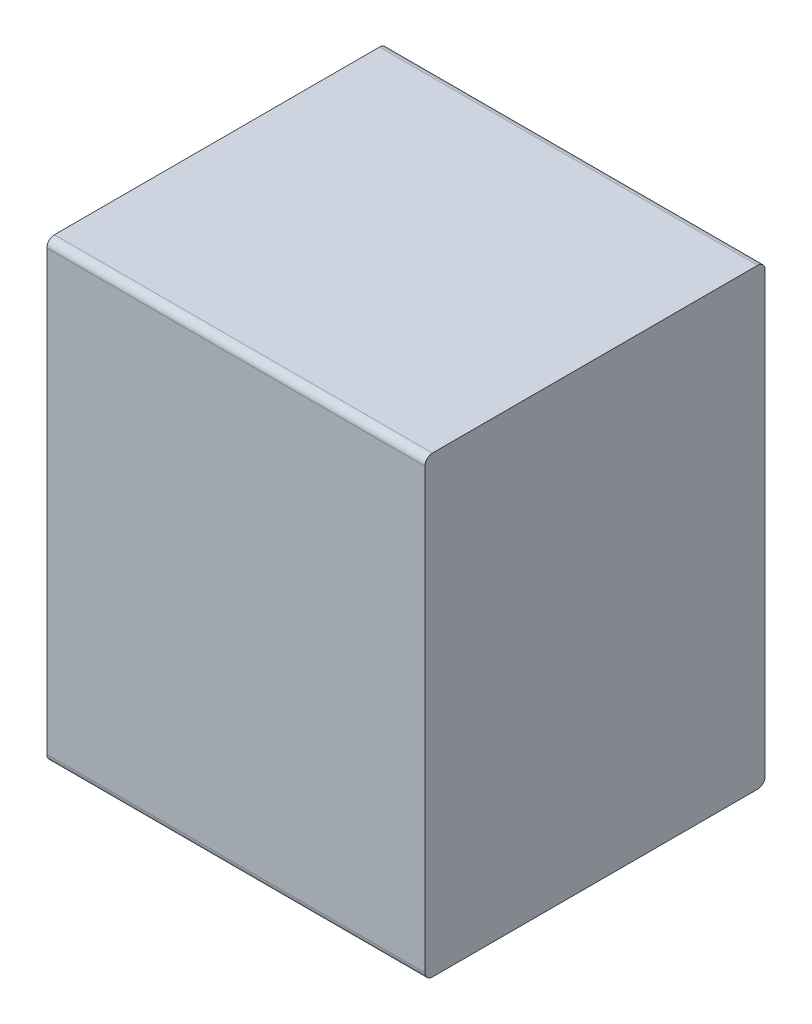
ISO-10303-21;
HEADER;
FILE_DESCRIPTION(('STEP AP214'),'2;1');
FILE_NAME('part.step','',(''),(''),'','','');
FILE_SCHEMA(('AUTOMOTIVE_DESIGN { 1 0 10303 214 1 1 1 1 }'));
ENDSEC;
DATA;
#1=APPLICATION_CONTEXT('core data for automotive mechanical design processes');
#2=APPLICATION_PROTOCOL_DEFINITION('international standard','automotive_design',2000,#1);
#3=PRODUCT_CONTEXT('',#1,'mechanical');
#4=PRODUCT('Part','Part','',(#3));
#5=PRODUCT_RELATED_PRODUCT_CATEGORY('part','',(#4));
#6=PRODUCT_DEFINITION_FORMATION('','',#4);
#7=PRODUCT_DEFINITION_CONTEXT('part definition',#1,'design');
#8=PRODUCT_DEFINITION('design','',#6,#7);
#9=PRODUCT_DEFINITION_SHAPE('','',#8);
#10=(LENGTH_UNIT() NAMED_UNIT(*) SI_UNIT(.MILLI.,.METRE.));
#11=(NAMED_UNIT(*) PLANE_ANGLE_UNIT() SI_UNIT($,.RADIAN.));
#12=(NAMED_UNIT(*) SI_UNIT($,.STERADIAN.) SOLID_ANGLE_UNIT());
#13=UNCERTAINTY_MEASURE_WITH_UNIT(LENGTH_MEASURE(1.E-05),#10,'distance_accuracy_value','');
#14=(GEOMETRIC_REPRESENTATION_CONTEXT(3) GLOBAL_UNCERTAINTY_ASSIGNED_CONTEXT((#13)) GLOBAL_UNIT_ASSIGNED_CONTEXT((#10,
#11,#12)) REPRESENTATION_CONTEXT('',''));
#15=CARTESIAN_POINT('',(0.,0.,0.));
#16=DIRECTION('',(0.,0.,1.));
#17=DIRECTION('',(1.,0.,0.));
#18=AXIS2_PLACEMENT_3D('',#15,#16,#17);
#19=CARTESIAN_POINT('',(91.686000000119,29.5359999998974,2.033253988));
#20=DIRECTION('',(-1.,2.05103428515331E-10,0.));
#21=DIRECTION('',(-2.05103428515331E-10,-1.,0.));
#22=AXIS2_PLACEMENT_3D('',#19,#20,#21);
#23=CYLINDRICAL_SURFACE('',#22,0.02);
#24=CARTESIAN_POINT('',(90.686000000119,29.5360000001025,2.033253988));
#25=DIRECTION('',(-1.,2.05103428515331E-10,0.));
#26=DIRECTION('',(-2.05103428515331E-10,-1.,0.));
#27=AXIS2_PLACEMENT_3D('',#24,#25,#26);
#28=CIRCLE('',#27,0.02);
#29=CARTESIAN_POINT('',(90.686000000119,29.536,2.013253988));
#30=VERTEX_POINT('',#29);
#31=CARTESIAN_POINT('',(90.6860000001231,29.5560000001026,2.033253988));
#32=VERTEX_POINT('',#31);
#33=EDGE_CURVE('E100',#30,#32,#28,.F.);
#34=ORIENTED_EDGE('',*,*,#33,.T.);
#35=DIRECTION('',(1.,-2.05103428515331E-10,0.));
#36=VECTOR('',#35,1.);
#37=CARTESIAN_POINT('',(91.6860000001231,29.5559999998974,2.033253988));
#38=LINE('',#37,#36);
#39=CARTESIAN_POINT('',(91.6860000001231,29.5559999998974,2.033253988));
#40=VERTEX_POINT('',#39);
#41=EDGE_CURVE('E97',#32,#40,#38,.T.);
#42=ORIENTED_EDGE('',*,*,#41,.T.);
#43=CARTESIAN_POINT('',(91.686000000119,29.5359999998974,2.033253988));
#44=DIRECTION('',(-1.,2.05103428515331E-10,0.));
#45=DIRECTION('',(-2.05103428515331E-10,-1.,0.));
#46=AXIS2_PLACEMENT_3D('',#43,#44,#45);
#47=CIRCLE('',#46,0.02);
#48=CARTESIAN_POINT('',(91.686000000119,29.5359999998974,2.013253988));
#49=VERTEX_POINT('',#48);
#50=EDGE_CURVE('E127',#40,#49,#47,.T.);
#51=ORIENTED_EDGE('',*,*,#50,.T.);
#52=DIRECTION('',(1.,0.,0.));
#53=VECTOR('',#52,1.);
#54=CARTESIAN_POINT('',(90.6860000001231,29.5359999998974,2.013253988));
#55=LINE('',#54,#53);
#56=EDGE_CURVE('E92',#49,#30,#55,.F.);
#57=ORIENTED_EDGE('',*,*,#56,.T.);
#58=EDGE_LOOP('',(#34,#42,#51,#57));
#59=FACE_BOUND('',#58,.T.);
#60=ADVANCED_FACE('F17',(#59),#23,.T.);
#61=CARTESIAN_POINT('',(90.6860000001231,29.5560000001026,2.013253988));
#62=DIRECTION('',(0.,0.,1.));
#63=DIRECTION('',(1.,0.,0.));
#64=AXIS2_PLACEMENT_3D('',#61,#62,#63);
#65=PLANE('',#64);
#66=ORIENTED_EDGE('',*,*,#56,.F.);
#67=DIRECTION('',(-2.05103428515331E-10,-1.,0.));
#68=VECTOR('',#67,1.);
#69=CARTESIAN_POINT('',(91.6859999998769,28.3559999998974,2.013253988));
#70=LINE('',#69,#68);
#71=CARTESIAN_POINT('',(91.685999999881,28.3759999998975,2.013253988));
#72=VERTEX_POINT('',#71);
#73=EDGE_CURVE('E90',#49,#72,#70,.T.);
#74=ORIENTED_EDGE('',*,*,#73,.T.);
#75=DIRECTION('',(1.,-2.05103428515331E-10,0.));
#76=VECTOR('',#75,1.);
#77=CARTESIAN_POINT('',(90.685999999881,28.3760000001026,2.013253988));
#78=LINE('',#77,#76);
#79=CARTESIAN_POINT('',(90.685999999881,28.3760000001026,2.013253988));
#80=VERTEX_POINT('',#79);
#81=EDGE_CURVE('E83',#80,#72,#78,.T.);
#82=ORIENTED_EDGE('',*,*,#81,.F.);
#83=DIRECTION('',(2.05103428515331E-10,1.,0.));
#84=VECTOR('',#83,1.);
#85=CARTESIAN_POINT('',(90.6860000001231,29.5560000001026,2.013253988));
#86=LINE('',#85,#84);
#87=EDGE_CURVE('E87',#80,#30,#86,.T.);
#88=ORIENTED_EDGE('',*,*,#87,.T.);
#89=EDGE_LOOP('',(#66,#74,#82,#88));
#90=FACE_BOUND('',#89,.T.);
#91=ADVANCED_FACE('F85',(#90),#65,.F.);
#92=CARTESIAN_POINT('',(90.685999999881,28.3760000001026,2.033253988));
#93=DIRECTION('',(1.,-2.05103428515331E-10,0.));
#94=DIRECTION('',(2.05103428515331E-10,1.,0.));
#95=AXIS2_PLACEMENT_3D('',#92,#93,#94);
#96=CYLINDRICAL_SURFACE('',#95,0.02);
#97=CARTESIAN_POINT('',(91.685999999881,28.3759999998975,2.033253988));
#98=DIRECTION('',(1.,-2.05103428515331E-10,0.));
#99=DIRECTION('',(2.05103428515331E-10,1.,0.));
#100=AXIS2_PLACEMENT_3D('',#97,#98,#99);
#101=CIRCLE('',#100,0.02);
#102=CARTESIAN_POINT('',(91.6859999998769,28.3559999998974,2.033253988));
#103=VERTEX_POINT('',#102);
#104=EDGE_CURVE('E125',#72,#103,#101,.F.);
#105=ORIENTED_EDGE('',*,*,#104,.T.);
#106=DIRECTION('',(-1.,2.05103428515331E-10,0.));
#107=VECTOR('',#106,1.);
#108=CARTESIAN_POINT('',(90.6859999998769,28.3560000001026,2.033253988));
#109=LINE('',#108,#107);
#110=CARTESIAN_POINT('',(90.685999999877,28.3560000001026,2.033253988));
#111=VERTEX_POINT('',#110);
#112=EDGE_CURVE('E77',#103,#111,#109,.T.);
#113=ORIENTED_EDGE('',*,*,#112,.T.);
#114=CARTESIAN_POINT('',(90.685999999881,28.3760000001026,2.033253988));
#115=DIRECTION('',(1.,-2.05103428515331E-10,0.));
#116=DIRECTION('',(2.05103428515331E-10,1.,0.));
#117=AXIS2_PLACEMENT_3D('',#114,#115,#116);
#118=CIRCLE('',#117,0.02);
#119=EDGE_CURVE('E20',#111,#80,#118,.T.);
#120=ORIENTED_EDGE('',*,*,#119,.T.);
#121=ORIENTED_EDGE('',*,*,#81,.T.);
#122=EDGE_LOOP('',(#105,#113,#120,#121));
#123=FACE_BOUND('',#122,.T.);
#124=ADVANCED_FACE('F95',(#123),#96,.T.);
#125=CARTESIAN_POINT('',(90.6859999998769,28.3560000001026,2.913253988));
#126=DIRECTION('',(2.05103428515331E-10,1.,0.));
#127=DIRECTION('',(-1.,2.05103428515331E-10,0.));
#128=AXIS2_PLACEMENT_3D('',#125,#126,#127);
#129=PLANE('',#128);
#130=DIRECTION('',(-1.,2.05103428515331E-10,0.));
#131=VECTOR('',#130,1.);
#132=CARTESIAN_POINT('',(90.6859999998769,28.3560000001026,2.893253988));
#133=LINE('',#132,#131);
#134=CARTESIAN_POINT('',(90.6859999998769,28.3560000001026,2.893253988));
#135=VERTEX_POINT('',#134);
#136=CARTESIAN_POINT('',(91.6859999998769,28.3559999998974,2.893253988));
#137=VERTEX_POINT('',#136);
#138=EDGE_CURVE('E110',#135,#137,#133,.F.);
#139=ORIENTED_EDGE('',*,*,#138,.F.);
#140=DIRECTION('',(0.,0.,1.));
#141=VECTOR('',#140,1.);
#142=CARTESIAN_POINT('',(90.685999999877,28.3560000001026,2.913253988));
#143=LINE('',#142,#141);
#144=EDGE_CURVE('E130',#135,#111,#143,.F.);
#145=ORIENTED_EDGE('',*,*,#144,.T.);
#146=ORIENTED_EDGE('',*,*,#112,.F.);
#147=DIRECTION('',(0.,0.,1.));
#148=VECTOR('',#147,1.);
#149=CARTESIAN_POINT('',(91.6859999998769,28.3559999998974,2.913253988));
#150=LINE('',#149,#148);
#151=EDGE_CURVE('E124',#103,#137,#150,.T.);
#152=ORIENTED_EDGE('',*,*,#151,.T.);
#153=EDGE_LOOP('',(#139,#145,#146,#152));
#154=FACE_BOUND('',#153,.T.);
#155=ADVANCED_FACE('F148',(#154),#129,.F.);
#156=CARTESIAN_POINT('',(91.6860000001231,29.5559999998974,2.913253988));
#157=DIRECTION('',(-2.05103428515331E-10,-1.,0.));
#158=DIRECTION('',(1.,-2.05103428515331E-10,0.));
#159=AXIS2_PLACEMENT_3D('',#156,#157,#158);
#160=PLANE('',#159);
#161=DIRECTION('',(1.,-2.05103428515331E-10,0.));
#162=VECTOR('',#161,1.);
#163=CARTESIAN_POINT('',(90.6860000001231,29.5560000001026,2.893253988));
#164=LINE('',#163,#162);
#165=CARTESIAN_POINT('',(91.6860000001231,29.5559999998974,2.893253988));
#166=VERTEX_POINT('',#165);
#167=CARTESIAN_POINT('',(90.6860000001231,29.5560000001026,2.893253988));
#168=VERTEX_POINT('',#167);
#169=EDGE_CURVE('E106',#166,#168,#164,.F.);
#170=ORIENTED_EDGE('',*,*,#169,.F.);
#171=DIRECTION('',(0.,0.,1.));
#172=VECTOR('',#171,1.);
#173=CARTESIAN_POINT('',(91.686000000123,29.5559999998974,2.913253988));
#174=LINE('',#173,#172);
#175=EDGE_CURVE('E113',#166,#40,#174,.F.);
#176=ORIENTED_EDGE('',*,*,#175,.T.);
#177=ORIENTED_EDGE('',*,*,#41,.F.);
#178=DIRECTION('',(0.,0.,1.));
#179=VECTOR('',#178,1.);
#180=CARTESIAN_POINT('',(90.6860000001231,29.5560000001026,2.913253988));
#181=LINE('',#180,#179);
#182=EDGE_CURVE('E102',#32,#168,#181,.T.);
#183=ORIENTED_EDGE('',*,*,#182,.T.);
#184=EDGE_LOOP('',(#170,#176,#177,#183));
#185=FACE_BOUND('',#184,.T.);
#186=ADVANCED_FACE('F160',(#185),#160,.F.);
#187=CARTESIAN_POINT('',(90.6860000001231,29.5560000001026,2.913253988));
#188=DIRECTION('',(1.,-2.05103428515331E-10,0.));
#189=DIRECTION('',(2.05103428515331E-10,1.,0.));
#190=AXIS2_PLACEMENT_3D('',#187,#188,#189);
#191=PLANE('',#190);
#192=CARTESIAN_POINT('',(90.685999999881,28.3760000001026,2.893253988));
#193=DIRECTION('',(-1.,2.05103428515331E-10,0.));
#194=DIRECTION('',(-2.05103428515331E-10,-1.,0.));
#195=AXIS2_PLACEMENT_3D('',#192,#193,#194);
#196=CIRCLE('',#195,0.02);
#197=CARTESIAN_POINT('',(90.686,28.3760000001026,2.913253988));
#198=VERTEX_POINT('',#197);
#199=EDGE_CURVE('E114',#198,#135,#196,.F.);
#200=ORIENTED_EDGE('',*,*,#199,.F.);
#201=DIRECTION('',(0.,1.,0.));
#202=VECTOR('',#201,1.);
#203=CARTESIAN_POINT('',(90.686000000119,29.5560000001026,2.913253988));
#204=LINE('',#203,#202);
#205=CARTESIAN_POINT('',(90.686000000119,29.5359999999487,2.913253988));
#206=VERTEX_POINT('',#205);
#207=EDGE_CURVE('E120',#206,#198,#204,.F.);
#208=ORIENTED_EDGE('',*,*,#207,.F.);
#209=CARTESIAN_POINT('',(90.686000000119,29.5360000001026,2.893253988));
#210=DIRECTION('',(1.,-2.05103428515331E-10,0.));
#211=DIRECTION('',(2.05103428515331E-10,1.,0.));
#212=AXIS2_PLACEMENT_3D('',#209,#210,#211);
#213=CIRCLE('',#212,0.02);
#214=EDGE_CURVE('E109',#168,#206,#213,.T.);
#215=ORIENTED_EDGE('',*,*,#214,.F.);
#216=ORIENTED_EDGE('',*,*,#182,.F.);
#217=ORIENTED_EDGE('',*,*,#33,.F.);
#218=ORIENTED_EDGE('',*,*,#87,.F.);
#219=ORIENTED_EDGE('',*,*,#119,.F.);
#220=ORIENTED_EDGE('',*,*,#144,.F.);
#221=EDGE_LOOP('',(#200,#208,#215,#216,#217,#218,#219,#220));
#222=FACE_BOUND('',#221,.T.);
#223=ADVANCED_FACE('F98',(#222),#191,.F.);
#224=CARTESIAN_POINT('',(90.685999999881,28.3760000001026,2.893253988));
#225=DIRECTION('',(-1.,2.05103428515331E-10,0.));
#226=DIRECTION('',(-2.05103428515331E-10,-1.,0.));
#227=AXIS2_PLACEMENT_3D('',#224,#225,#226);
#228=CYLINDRICAL_SURFACE('',#227,0.02);
#229=CARTESIAN_POINT('',(91.685999999881,28.3759999998975,2.893253988));
#230=DIRECTION('',(-1.,2.05103428515331E-10,0.));
#231=DIRECTION('',(-2.05103428515331E-10,-1.,0.));
#232=AXIS2_PLACEMENT_3D('',#229,#230,#231);
#233=CIRCLE('',#232,0.02);
#234=CARTESIAN_POINT('',(91.685999999881,28.376,2.913253988));
#235=VERTEX_POINT('',#234);
#236=EDGE_CURVE('E122',#137,#235,#233,.T.);
#237=ORIENTED_EDGE('',*,*,#236,.T.);
#238=DIRECTION('',(1.,0.,0.));
#239=VECTOR('',#238,1.);
#240=CARTESIAN_POINT('',(90.6860000001231,28.3760000001026,2.913253988));
#241=LINE('',#240,#239);
#242=EDGE_CURVE('E138',#198,#235,#241,.T.);
#243=ORIENTED_EDGE('',*,*,#242,.F.);
#244=ORIENTED_EDGE('',*,*,#199,.T.);
#245=ORIENTED_EDGE('',*,*,#138,.T.);
#246=EDGE_LOOP('',(#237,#243,#244,#245));
#247=FACE_BOUND('',#246,.T.);
#248=ADVANCED_FACE('F150',(#247),#228,.T.);
#249=CARTESIAN_POINT('',(91.6859999998769,28.3559999998974,2.913253988));
#250=DIRECTION('',(-1.,2.05103428515331E-10,0.));
#251=DIRECTION('',(-2.05103428515331E-10,-1.,0.));
#252=AXIS2_PLACEMENT_3D('',#249,#250,#251);
#253=PLANE('',#252);
#254=ORIENTED_EDGE('',*,*,#236,.F.);
#255=ORIENTED_EDGE('',*,*,#151,.F.);
#256=ORIENTED_EDGE('',*,*,#104,.F.);
#257=ORIENTED_EDGE('',*,*,#73,.F.);
#258=ORIENTED_EDGE('',*,*,#50,.F.);
#259=ORIENTED_EDGE('',*,*,#175,.F.);
#260=CARTESIAN_POINT('',(91.686000000119,29.5359999998975,2.893253988));
#261=DIRECTION('',(1.,-2.05103428515331E-10,0.));
#262=DIRECTION('',(2.05103428515331E-10,1.,0.));
#263=AXIS2_PLACEMENT_3D('',#260,#261,#262);
#264=CIRCLE('',#263,0.02);
#265=CARTESIAN_POINT('',(91.686,29.5359999998974,2.913253988));
#266=VERTEX_POINT('',#265);
#267=EDGE_CURVE('E35',#266,#166,#264,.F.);
#268=ORIENTED_EDGE('',*,*,#267,.F.);
#269=DIRECTION('',(0.,1.,0.));
#270=VECTOR('',#269,1.);
#271=CARTESIAN_POINT('',(91.685999999881,29.5560000001026,2.913253988));
#272=LINE('',#271,#270);
#273=EDGE_CURVE('E26',#235,#266,#272,.T.);
#274=ORIENTED_EDGE('',*,*,#273,.F.);
#275=EDGE_LOOP('',(#254,#255,#256,#257,#258,#259,#268,#274));
#276=FACE_BOUND('',#275,.T.);
#277=ADVANCED_FACE('F151',(#276),#253,.F.);
#278=CARTESIAN_POINT('',(90.686000000119,29.5360000001026,2.893253988));
#279=DIRECTION('',(1.,-2.05103428515331E-10,0.));
#280=DIRECTION('',(2.05103428515331E-10,1.,0.));
#281=AXIS2_PLACEMENT_3D('',#278,#279,#280);
#282=CYLINDRICAL_SURFACE('',#281,0.02);
#283=ORIENTED_EDGE('',*,*,#214,.T.);
#284=DIRECTION('',(1.,0.,0.));
#285=VECTOR('',#284,1.);
#286=CARTESIAN_POINT('',(90.6860000001231,29.5359999998974,2.913253988));
#287=LINE('',#286,#285);
#288=EDGE_CURVE('E11',#266,#206,#287,.F.);
#289=ORIENTED_EDGE('',*,*,#288,.F.);
#290=ORIENTED_EDGE('',*,*,#267,.T.);
#291=ORIENTED_EDGE('',*,*,#169,.T.);
#292=EDGE_LOOP('',(#283,#289,#290,#291));
#293=FACE_BOUND('',#292,.T.);
#294=ADVANCED_FACE('F157',(#293),#282,.T.);
#295=CARTESIAN_POINT('',(90.6860000001231,29.5560000001026,2.913253988));
#296=DIRECTION('',(0.,0.,1.));
#297=DIRECTION('',(1.,0.,0.));
#298=AXIS2_PLACEMENT_3D('',#295,#296,#297);
#299=PLANE('',#298);
#300=ORIENTED_EDGE('',*,*,#273,.T.);
#301=ORIENTED_EDGE('',*,*,#288,.T.);
#302=ORIENTED_EDGE('',*,*,#207,.T.);
#303=ORIENTED_EDGE('',*,*,#242,.T.);
#304=EDGE_LOOP('',(#300,#301,#302,#303));
#305=FACE_BOUND('',#304,.T.);
#306=ADVANCED_FACE('F153',(#305),#299,.T.);
#307=CLOSED_SHELL('',(#60,#91,#124,#155,#186,#223,#248,#277,#294,#306));
#308=MANIFOLD_SOLID_BREP('B1',#307);
#309=ADVANCED_BREP_SHAPE_REPRESENTATION('',(#18,#308),#14);
#310=SHAPE_DEFINITION_REPRESENTATION(#9,#309);
ENDSEC;
END-ISO-10303-21;
